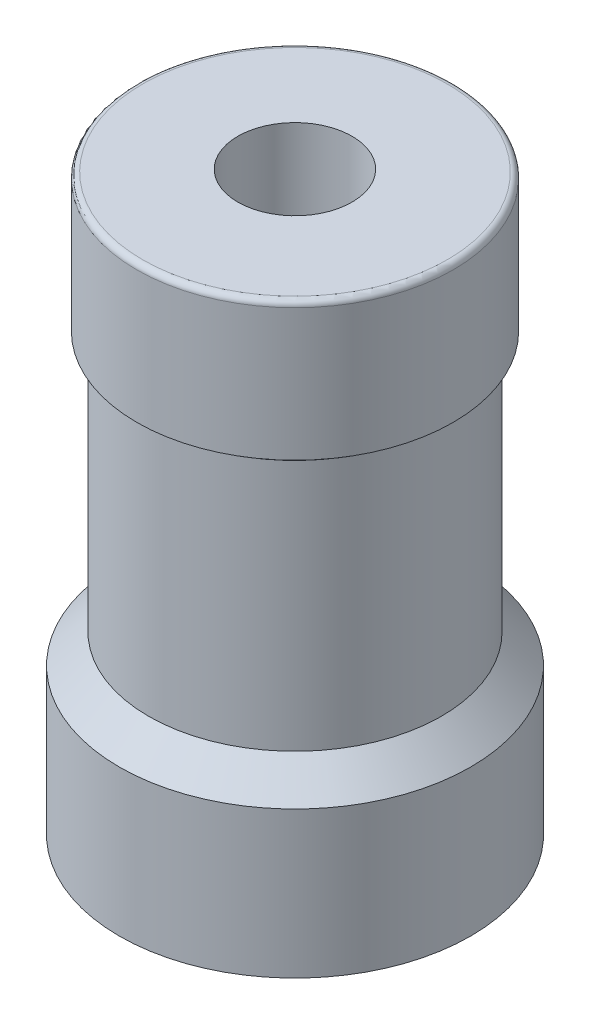
ISO-10303-21;
HEADER;
FILE_DESCRIPTION(('STEP AP214'),'2;1');
FILE_NAME('part.step','',(''),(''),'','','');
FILE_SCHEMA(('AUTOMOTIVE_DESIGN { 1 0 10303 214 1 1 1 1 }'));
ENDSEC;
DATA;
#1=APPLICATION_CONTEXT('core data for automotive mechanical design processes');
#2=APPLICATION_PROTOCOL_DEFINITION('international standard','automotive_design',2000,#1);
#3=PRODUCT_CONTEXT('',#1,'mechanical');
#4=PRODUCT('Part','Part','',(#3));
#5=PRODUCT_RELATED_PRODUCT_CATEGORY('part','',(#4));
#6=PRODUCT_DEFINITION_FORMATION('','',#4);
#7=PRODUCT_DEFINITION_CONTEXT('part definition',#1,'design');
#8=PRODUCT_DEFINITION('design','',#6,#7);
#9=PRODUCT_DEFINITION_SHAPE('','',#8);
#10=(LENGTH_UNIT() NAMED_UNIT(*) SI_UNIT(.MILLI.,.METRE.));
#11=(NAMED_UNIT(*) PLANE_ANGLE_UNIT() SI_UNIT($,.RADIAN.));
#12=(NAMED_UNIT(*) SI_UNIT($,.STERADIAN.) SOLID_ANGLE_UNIT());
#13=UNCERTAINTY_MEASURE_WITH_UNIT(LENGTH_MEASURE(1.E-05),#10,'distance_accuracy_value','');
#14=(GEOMETRIC_REPRESENTATION_CONTEXT(3) GLOBAL_UNCERTAINTY_ASSIGNED_CONTEXT((#13)) GLOBAL_UNIT_ASSIGNED_CONTEXT((#10,
#11,#12)) REPRESENTATION_CONTEXT('',''));
#15=CARTESIAN_POINT('',(0.,0.,0.));
#16=DIRECTION('',(0.,0.,1.));
#17=DIRECTION('',(1.,0.,0.));
#18=AXIS2_PLACEMENT_3D('',#15,#16,#17);
#19=CARTESIAN_POINT('',(0.,0.,0.));
#20=DIRECTION('',(0.,-1.,0.));
#21=DIRECTION('',(0.,0.,-1.));
#22=AXIS2_PLACEMENT_3D('',#19,#20,#21);
#23=PLANE('',#22);
#24=CARTESIAN_POINT('',(17.5314269813067,0.,-10.1441617389618));
#25=DIRECTION('',(0.,-1.,0.));
#26=DIRECTION('',(0.,0.,-1.));
#27=AXIS2_PLACEMENT_3D('',#24,#25,#26);
#28=CIRCLE('',#27,2.75);
#29=CARTESIAN_POINT('',(17.5314269813067,0.,-12.8941617389618));
#30=VERTEX_POINT('',#29);
#31=EDGE_CURVE('E72',#30,#30,#28,.T.);
#32=ORIENTED_EDGE('',*,*,#31,.F.);
#33=EDGE_LOOP('',(#32));
#34=FACE_BOUND('',#33,.T.);
#35=CARTESIAN_POINT('',(-17.4024456393651,0.,-10.3638716296589));
#36=DIRECTION('',(0.,-1.,0.));
#37=DIRECTION('',(0.,0.,-1.));
#38=AXIS2_PLACEMENT_3D('',#35,#36,#37);
#39=CIRCLE('',#38,2.75);
#40=CARTESIAN_POINT('',(-17.4024456393651,0.,-13.1138716296589));
#41=VERTEX_POINT('',#40);
#42=EDGE_CURVE('E71',#41,#41,#39,.T.);
#43=ORIENTED_EDGE('',*,*,#42,.F.);
#44=EDGE_LOOP('',(#43));
#45=FACE_BOUND('',#44,.T.);
#46=CARTESIAN_POINT('',(-0.125783675835478,0.,19.999604457761));
#47=DIRECTION('',(0.,-1.,0.));
#48=DIRECTION('',(0.,0.,-1.));
#49=AXIS2_PLACEMENT_3D('',#46,#47,#48);
#50=CIRCLE('',#49,2.75);
#51=CARTESIAN_POINT('',(-0.125783675835478,0.,17.249604457761));
#52=VERTEX_POINT('',#51);
#53=EDGE_CURVE('E82',#52,#52,#50,.T.);
#54=ORIENTED_EDGE('',*,*,#53,.F.);
#55=EDGE_LOOP('',(#54));
#56=FACE_BOUND('',#55,.T.);
#57=CARTESIAN_POINT('',(0.,0.,0.));
#58=DIRECTION('',(0.,1.,0.));
#59=DIRECTION('',(0.,0.,1.));
#60=AXIS2_PLACEMENT_3D('',#57,#58,#59);
#61=CIRCLE('',#60,30.);
#62=CARTESIAN_POINT('',(0.,0.,30.));
#63=VERTEX_POINT('',#62);
#64=EDGE_CURVE('E103',#63,#63,#61,.T.);
#65=ORIENTED_EDGE('',*,*,#64,.F.);
#66=EDGE_LOOP('',(#65));
#67=FACE_BOUND('',#66,.T.);
#68=ADVANCED_FACE('F40',(#34,#45,#56,#67),#23,.T.);
#69=CARTESIAN_POINT('',(0.,214.37550731324,0.));
#70=DIRECTION('',(0.,1.,0.));
#71=DIRECTION('',(0.,0.,1.));
#72=AXIS2_PLACEMENT_3D('',#69,#70,#71);
#73=CYLINDRICAL_SURFACE('',#72,30.);
#74=CARTESIAN_POINT('',(0.,25.,0.));
#75=DIRECTION('',(0.,1.,0.));
#76=DIRECTION('',(0.,0.,1.));
#77=AXIS2_PLACEMENT_3D('',#74,#75,#76);
#78=CIRCLE('',#77,30.);
#79=CARTESIAN_POINT('',(0.,25.,30.));
#80=VERTEX_POINT('',#79);
#81=EDGE_CURVE('E106',#80,#80,#78,.F.);
#82=ORIENTED_EDGE('',*,*,#81,.T.);
#83=EDGE_LOOP('',(#82));
#84=FACE_BOUND('',#83,.T.);
#85=ORIENTED_EDGE('',*,*,#64,.T.);
#86=EDGE_LOOP('',(#85));
#87=FACE_BOUND('',#86,.T.);
#88=ADVANCED_FACE('F128',(#84,#87),#73,.T.);
#89=CARTESIAN_POINT('',(0.,214.37550731324,0.));
#90=DIRECTION('',(0.,1.,0.));
#91=DIRECTION('',(0.,0.,1.));
#92=AXIS2_PLACEMENT_3D('',#89,#90,#91);
#93=CYLINDRICAL_SURFACE('',#92,25.);
#94=CARTESIAN_POINT('',(0.,30.,0.));
#95=DIRECTION('',(0.,1.,0.));
#96=DIRECTION('',(0.,0.,1.));
#97=AXIS2_PLACEMENT_3D('',#94,#95,#96);
#98=CIRCLE('',#97,25.);
#99=CARTESIAN_POINT('',(0.,30.,25.));
#100=VERTEX_POINT('',#99);
#101=EDGE_CURVE('E100',#100,#100,#98,.T.);
#102=ORIENTED_EDGE('',*,*,#101,.T.);
#103=EDGE_LOOP('',(#102));
#104=FACE_BOUND('',#103,.T.);
#105=CARTESIAN_POINT('',(0.,73.,0.));
#106=DIRECTION('',(0.,1.,0.));
#107=DIRECTION('',(0.,0.,1.));
#108=AXIS2_PLACEMENT_3D('',#105,#106,#107);
#109=CIRCLE('',#108,25.);
#110=CARTESIAN_POINT('',(0.,73.,25.));
#111=VERTEX_POINT('',#110);
#112=EDGE_CURVE('E97',#111,#111,#109,.T.);
#113=ORIENTED_EDGE('',*,*,#112,.F.);
#114=EDGE_LOOP('',(#113));
#115=FACE_BOUND('',#114,.T.);
#116=ADVANCED_FACE('F134',(#104,#115),#93,.T.);
#117=CARTESIAN_POINT('',(0.,74.450346011955,0.));
#118=DIRECTION('',(0.,1.,0.));
#119=DIRECTION('',(0.,0.,1.));
#120=AXIS2_PLACEMENT_3D('',#117,#118,#119);
#121=CONICAL_SURFACE('',#120,27.,0.943374743774861);
#122=ORIENTED_EDGE('',*,*,#112,.T.);
#123=EDGE_LOOP('',(#122));
#124=FACE_BOUND('',#123,.T.);
#125=CARTESIAN_POINT('',(0.,74.450346011955,0.));
#126=DIRECTION('',(0.,1.,0.));
#127=DIRECTION('',(0.,0.,1.));
#128=AXIS2_PLACEMENT_3D('',#125,#126,#127);
#129=CIRCLE('',#128,27.);
#130=CARTESIAN_POINT('',(0.,74.450346011955,27.));
#131=VERTEX_POINT('',#130);
#132=EDGE_CURVE('E94',#131,#131,#129,.T.);
#133=ORIENTED_EDGE('',*,*,#132,.F.);
#134=EDGE_LOOP('',(#133));
#135=FACE_BOUND('',#134,.T.);
#136=ADVANCED_FACE('F145',(#124,#135),#121,.T.);
#137=CARTESIAN_POINT('',(0.,214.37550731324,0.));
#138=DIRECTION('',(0.,1.,0.));
#139=DIRECTION('',(0.,0.,1.));
#140=AXIS2_PLACEMENT_3D('',#137,#138,#139);
#141=CYLINDRICAL_SURFACE('',#140,27.);
#142=CARTESIAN_POINT('',(0.,97.,0.));
#143=DIRECTION('',(0.,1.,0.));
#144=DIRECTION('',(0.,0.,1.));
#145=AXIS2_PLACEMENT_3D('',#142,#143,#144);
#146=CIRCLE('',#145,27.);
#147=CARTESIAN_POINT('',(0.,97.,27.));
#148=VERTEX_POINT('',#147);
#149=EDGE_CURVE('E11',#148,#148,#146,.F.);
#150=ORIENTED_EDGE('',*,*,#149,.T.);
#151=EDGE_LOOP('',(#150));
#152=FACE_BOUND('',#151,.T.);
#153=ORIENTED_EDGE('',*,*,#132,.T.);
#154=EDGE_LOOP('',(#153));
#155=FACE_BOUND('',#154,.T.);
#156=ADVANCED_FACE('F149',(#152,#155),#141,.T.);
#157=CARTESIAN_POINT('',(0.,98.,27.));
#158=DIRECTION('',(0.,1.,0.));
#159=DIRECTION('',(0.,0.,1.));
#160=AXIS2_PLACEMENT_3D('',#157,#158,#159);
#161=PLANE('',#160);
#162=CARTESIAN_POINT('',(0.,98.,0.));
#163=DIRECTION('',(0.,1.,0.));
#164=DIRECTION('',(0.,0.,1.));
#165=AXIS2_PLACEMENT_3D('',#162,#163,#164);
#166=CIRCLE('',#165,26.);
#167=CARTESIAN_POINT('',(0.,98.,26.));
#168=VERTEX_POINT('',#167);
#169=EDGE_CURVE('E48',#168,#168,#166,.T.);
#170=ORIENTED_EDGE('',*,*,#169,.T.);
#171=EDGE_LOOP('',(#170));
#172=FACE_BOUND('',#171,.T.);
#173=CARTESIAN_POINT('',(-0.400317764528033,98.,-0.39031458424949));
#174=DIRECTION('',(0.,1.,0.));
#175=DIRECTION('',(0.,0.,1.));
#176=AXIS2_PLACEMENT_3D('',#173,#174,#175);
#177=CIRCLE('',#176,9.74999999999999);
#178=CARTESIAN_POINT('',(-0.400317764528033,98.,9.3596854157505));
#179=VERTEX_POINT('',#178);
#180=EDGE_CURVE('E88',#179,#179,#177,.T.);
#181=ORIENTED_EDGE('',*,*,#180,.F.);
#182=EDGE_LOOP('',(#181));
#183=FACE_BOUND('',#182,.T.);
#184=ADVANCED_FACE('F111',(#172,#183),#161,.T.);
#185=CARTESIAN_POINT('',(-0.400317764528033,44.,-0.39031458424949));
#186=DIRECTION('',(0.,1.,0.));
#187=DIRECTION('',(0.,0.,1.));
#188=AXIS2_PLACEMENT_3D('',#185,#186,#187);
#189=CONICAL_SURFACE('',#188,9.74999999999999,1.02974425867665);
#190=CARTESIAN_POINT('',(-0.400317764528049,38.1416089644813,-0.39031458424949));
#191=VERTEX_POINT('',#190);
#192=VERTEX_LOOP('',#191);
#193=FACE_BOUND('',#192,.T.);
#194=CARTESIAN_POINT('',(-0.400317764528033,44.,-0.39031458424949));
#195=DIRECTION('',(0.,1.,0.));
#196=DIRECTION('',(0.,0.,1.));
#197=AXIS2_PLACEMENT_3D('',#194,#195,#196);
#198=CIRCLE('',#197,9.74999999999999);
#199=CARTESIAN_POINT('',(-0.400317764528033,44.,9.3596854157505));
#200=VERTEX_POINT('',#199);
#201=EDGE_CURVE('E91',#200,#200,#198,.T.);
#202=ORIENTED_EDGE('',*,*,#201,.T.);
#203=EDGE_LOOP('',(#202));
#204=FACE_BOUND('',#203,.T.);
#205=ADVANCED_FACE('F156',(#193,#204),#189,.F.);
#206=CARTESIAN_POINT('',(-0.400317764528033,98.,-0.39031458424949));
#207=DIRECTION('',(0.,1.,0.));
#208=DIRECTION('',(0.,0.,1.));
#209=AXIS2_PLACEMENT_3D('',#206,#207,#208);
#210=CYLINDRICAL_SURFACE('',#209,9.74999999999999);
#211=ORIENTED_EDGE('',*,*,#201,.F.);
#212=EDGE_LOOP('',(#211));
#213=FACE_BOUND('',#212,.T.);
#214=ORIENTED_EDGE('',*,*,#180,.T.);
#215=EDGE_LOOP('',(#214));
#216=FACE_BOUND('',#215,.T.);
#217=ADVANCED_FACE('F124',(#213,#216),#210,.F.);
#218=CARTESIAN_POINT('',(0.,30.,0.));
#219=DIRECTION('',(0.,-1.,0.));
#220=DIRECTION('',(0.,0.,-1.));
#221=AXIS2_PLACEMENT_3D('',#218,#219,#220);
#222=CONICAL_SURFACE('',#221,25.,0.785398163397446);
#223=ORIENTED_EDGE('',*,*,#81,.F.);
#224=EDGE_LOOP('',(#223));
#225=FACE_BOUND('',#224,.T.);
#226=ORIENTED_EDGE('',*,*,#101,.F.);
#227=EDGE_LOOP('',(#226));
#228=FACE_BOUND('',#227,.T.);
#229=ADVANCED_FACE('F116',(#225,#228),#222,.T.);
#230=CARTESIAN_POINT('',(0.,97.,0.));
#231=DIRECTION('',(0.,1.,0.));
#232=DIRECTION('',(0.,0.,1.));
#233=AXIS2_PLACEMENT_3D('',#230,#231,#232);
#234=TOROIDAL_SURFACE('',#233,26.,1.);
#235=ORIENTED_EDGE('',*,*,#149,.F.);
#236=EDGE_LOOP('',(#235));
#237=FACE_BOUND('',#236,.T.);
#238=ORIENTED_EDGE('',*,*,#169,.F.);
#239=EDGE_LOOP('',(#238));
#240=FACE_BOUND('',#239,.T.);
#241=ADVANCED_FACE('F42',(#237,#240),#234,.T.);
#242=CARTESIAN_POINT('',(-0.125783675835478,25.,19.999604457761));
#243=DIRECTION('',(0.,-1.,0.));
#244=DIRECTION('',(0.,0.,-1.));
#245=AXIS2_PLACEMENT_3D('',#242,#243,#244);
#246=CONICAL_SURFACE('',#245,2.74999999999999,1.02974425867665);
#247=CARTESIAN_POINT('',(-0.125783675835485,26.6523667023258,19.999604457761));
#248=VERTEX_POINT('',#247);
#249=VERTEX_LOOP('',#248);
#250=FACE_BOUND('',#249,.T.);
#251=CARTESIAN_POINT('',(-0.125783675835478,25.,19.999604457761));
#252=DIRECTION('',(0.,-1.,0.));
#253=DIRECTION('',(0.,0.,-1.));
#254=AXIS2_PLACEMENT_3D('',#251,#252,#253);
#255=CIRCLE('',#254,2.74999999999999);
#256=CARTESIAN_POINT('',(-0.125783675835478,25.,17.249604457761));
#257=VERTEX_POINT('',#256);
#258=EDGE_CURVE('E85',#257,#257,#255,.T.);
#259=ORIENTED_EDGE('',*,*,#258,.T.);
#260=EDGE_LOOP('',(#259));
#261=FACE_BOUND('',#260,.T.);
#262=ADVANCED_FACE('F115',(#250,#261),#246,.F.);
#263=CARTESIAN_POINT('',(-0.125783675835478,0.,19.999604457761));
#264=DIRECTION('',(0.,-1.,0.));
#265=DIRECTION('',(0.,0.,-1.));
#266=AXIS2_PLACEMENT_3D('',#263,#264,#265);
#267=CYLINDRICAL_SURFACE('',#266,2.75);
#268=ORIENTED_EDGE('',*,*,#258,.F.);
#269=EDGE_LOOP('',(#268));
#270=FACE_BOUND('',#269,.T.);
#271=ORIENTED_EDGE('',*,*,#53,.T.);
#272=EDGE_LOOP('',(#271));
#273=FACE_BOUND('',#272,.T.);
#274=ADVANCED_FACE('F122',(#270,#273),#267,.F.);
#275=CARTESIAN_POINT('',(-17.4024456393651,25.,-10.3638716296589));
#276=DIRECTION('',(0.,-1.,0.));
#277=DIRECTION('',(0.,0.,-1.));
#278=AXIS2_PLACEMENT_3D('',#275,#276,#277);
#279=CONICAL_SURFACE('',#278,2.74999999999999,1.02974425867665);
#280=CARTESIAN_POINT('',(-17.4024456393651,26.6523667023258,-10.3638716296589));
#281=VERTEX_POINT('',#280);
#282=VERTEX_LOOP('',#281);
#283=FACE_BOUND('',#282,.T.);
#284=CARTESIAN_POINT('',(-17.4024456393651,25.,-10.3638716296589));
#285=DIRECTION('',(0.,-1.,0.));
#286=DIRECTION('',(0.,0.,-1.));
#287=AXIS2_PLACEMENT_3D('',#284,#285,#286);
#288=CIRCLE('',#287,2.74999999999999);
#289=CARTESIAN_POINT('',(-17.4024456393651,25.,-13.1138716296589));
#290=VERTEX_POINT('',#289);
#291=EDGE_CURVE('E75',#290,#290,#288,.T.);
#292=ORIENTED_EDGE('',*,*,#291,.T.);
#293=EDGE_LOOP('',(#292));
#294=FACE_BOUND('',#293,.T.);
#295=ADVANCED_FACE('F164',(#283,#294),#279,.F.);
#296=CARTESIAN_POINT('',(-17.4024456393651,0.,-10.3638716296589));
#297=DIRECTION('',(0.,-1.,0.));
#298=DIRECTION('',(0.,0.,-1.));
#299=AXIS2_PLACEMENT_3D('',#296,#297,#298);
#300=CYLINDRICAL_SURFACE('',#299,2.75);
#301=ORIENTED_EDGE('',*,*,#291,.F.);
#302=EDGE_LOOP('',(#301));
#303=FACE_BOUND('',#302,.T.);
#304=ORIENTED_EDGE('',*,*,#42,.T.);
#305=EDGE_LOOP('',(#304));
#306=FACE_BOUND('',#305,.T.);
#307=ADVANCED_FACE('F65',(#303,#306),#300,.F.);
#308=CARTESIAN_POINT('',(17.5314269813067,25.,-10.1441617389618));
#309=DIRECTION('',(0.,-1.,0.));
#310=DIRECTION('',(0.,0.,-1.));
#311=AXIS2_PLACEMENT_3D('',#308,#309,#310);
#312=CONICAL_SURFACE('',#311,2.75,1.02974425867665);
#313=CARTESIAN_POINT('',(17.5314269813067,26.6523667023258,-10.1441617389618));
#314=VERTEX_POINT('',#313);
#315=VERTEX_LOOP('',#314);
#316=FACE_BOUND('',#315,.T.);
#317=CARTESIAN_POINT('',(17.5314269813067,25.,-10.1441617389618));
#318=DIRECTION('',(0.,-1.,0.));
#319=DIRECTION('',(0.,0.,-1.));
#320=AXIS2_PLACEMENT_3D('',#317,#318,#319);
#321=CIRCLE('',#320,2.75);
#322=CARTESIAN_POINT('',(17.5314269813067,25.,-12.8941617389618));
#323=VERTEX_POINT('',#322);
#324=EDGE_CURVE('E69',#323,#323,#321,.T.);
#325=ORIENTED_EDGE('',*,*,#324,.T.);
#326=EDGE_LOOP('',(#325));
#327=FACE_BOUND('',#326,.T.);
#328=ADVANCED_FACE('F61',(#316,#327),#312,.F.);
#329=CARTESIAN_POINT('',(17.5314269813067,0.,-10.1441617389618));
#330=DIRECTION('',(0.,-1.,0.));
#331=DIRECTION('',(0.,0.,-1.));
#332=AXIS2_PLACEMENT_3D('',#329,#330,#331);
#333=CYLINDRICAL_SURFACE('',#332,2.75);
#334=ORIENTED_EDGE('',*,*,#324,.F.);
#335=EDGE_LOOP('',(#334));
#336=FACE_BOUND('',#335,.T.);
#337=ORIENTED_EDGE('',*,*,#31,.T.);
#338=EDGE_LOOP('',(#337));
#339=FACE_BOUND('',#338,.T.);
#340=ADVANCED_FACE('F64',(#336,#339),#333,.F.);
#341=CLOSED_SHELL('',(#68,#88,#116,#136,#156,#184,#205,#217,#229,#241,#262,#274,#295,#307,#328,#340));
#342=MANIFOLD_SOLID_BREP('B2',#341);
#343=ADVANCED_BREP_SHAPE_REPRESENTATION('',(#18,#342),#14);
#344=SHAPE_DEFINITION_REPRESENTATION(#9,#343);
ENDSEC;
END-ISO-10303-21;
